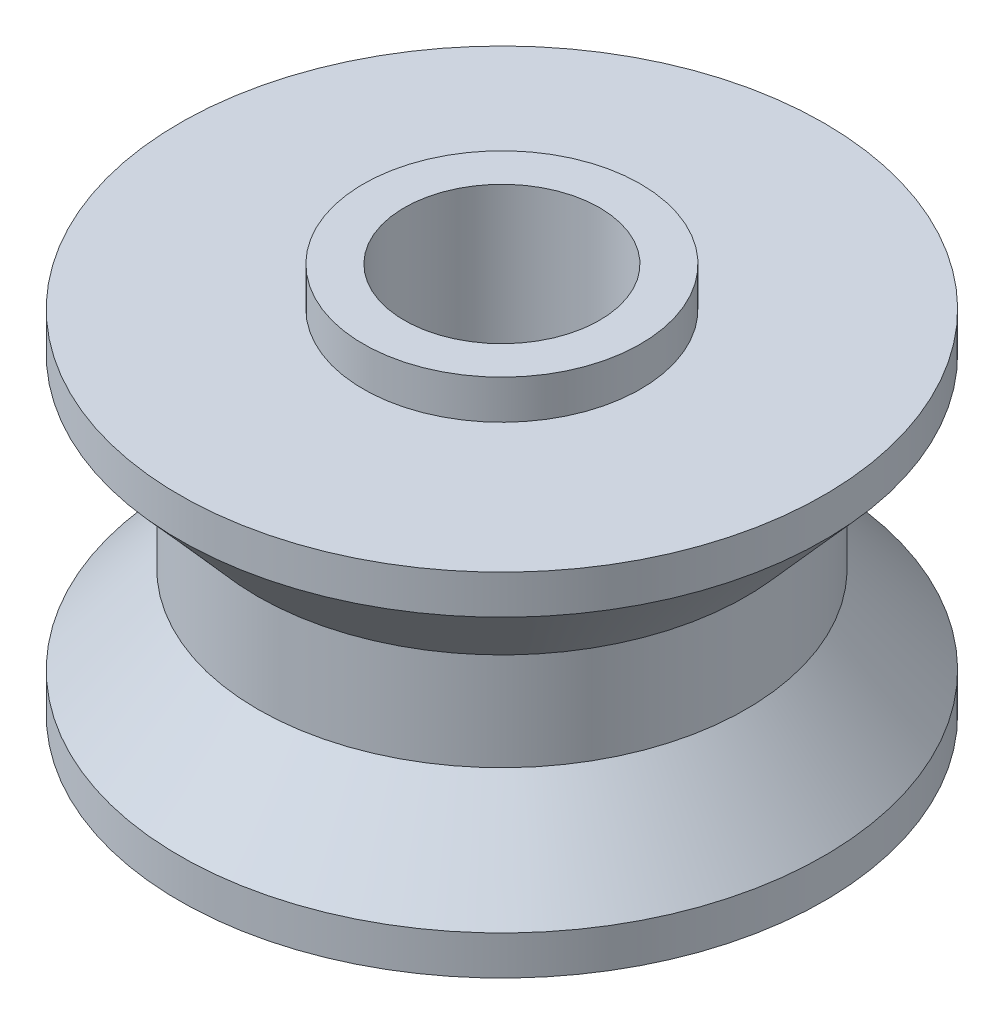
ISO-10303-21;
HEADER;
FILE_DESCRIPTION(('STEP AP214'),'2;1');
FILE_NAME('part.step','',(''),(''),'','','');
FILE_SCHEMA(('AUTOMOTIVE_DESIGN { 1 0 10303 214 1 1 1 1 }'));
ENDSEC;
DATA;
#1=APPLICATION_CONTEXT('core data for automotive mechanical design processes');
#2=APPLICATION_PROTOCOL_DEFINITION('international standard','automotive_design',2000,#1);
#3=PRODUCT_CONTEXT('',#1,'mechanical');
#4=PRODUCT('Part','Part','',(#3));
#5=PRODUCT_RELATED_PRODUCT_CATEGORY('part','',(#4));
#6=PRODUCT_DEFINITION_FORMATION('','',#4);
#7=PRODUCT_DEFINITION_CONTEXT('part definition',#1,'design');
#8=PRODUCT_DEFINITION('design','',#6,#7);
#9=PRODUCT_DEFINITION_SHAPE('','',#8);
#10=(LENGTH_UNIT() NAMED_UNIT(*) SI_UNIT(.MILLI.,.METRE.));
#11=(NAMED_UNIT(*) PLANE_ANGLE_UNIT() SI_UNIT($,.RADIAN.));
#12=(NAMED_UNIT(*) SI_UNIT($,.STERADIAN.) SOLID_ANGLE_UNIT());
#13=UNCERTAINTY_MEASURE_WITH_UNIT(LENGTH_MEASURE(1.E-05),#10,'distance_accuracy_value','');
#14=(GEOMETRIC_REPRESENTATION_CONTEXT(3) GLOBAL_UNCERTAINTY_ASSIGNED_CONTEXT((#13)) GLOBAL_UNIT_ASSIGNED_CONTEXT((#10,
#11,#12)) REPRESENTATION_CONTEXT('',''));
#15=CARTESIAN_POINT('',(0.,0.,0.));
#16=DIRECTION('',(0.,0.,1.));
#17=DIRECTION('',(1.,0.,0.));
#18=AXIS2_PLACEMENT_3D('',#15,#16,#17);
#19=CARTESIAN_POINT('',(0.,0.,0.));
#20=DIRECTION('',(0.,-1.,0.));
#21=DIRECTION('',(0.,0.,-1.));
#22=AXIS2_PLACEMENT_3D('',#19,#20,#21);
#23=CYLINDRICAL_SURFACE('',#22,2.5);
#24=CARTESIAN_POINT('',(0.,-5.5,0.));
#25=DIRECTION('',(0.,-1.,0.));
#26=DIRECTION('',(0.,0.,-1.));
#27=AXIS2_PLACEMENT_3D('',#24,#25,#26);
#28=CIRCLE('',#27,2.5);
#29=CARTESIAN_POINT('',(0.,-5.5,-2.5));
#30=VERTEX_POINT('',#29);
#31=EDGE_CURVE('E10',#30,#30,#28,.T.);
#32=ORIENTED_EDGE('',*,*,#31,.T.);
#33=EDGE_LOOP('',(#32));
#34=FACE_BOUND('',#33,.T.);
#35=CARTESIAN_POINT('',(0.,5.5,0.));
#36=DIRECTION('',(0.,-1.,0.));
#37=DIRECTION('',(0.,0.,-1.));
#38=AXIS2_PLACEMENT_3D('',#35,#36,#37);
#39=CIRCLE('',#38,2.5);
#40=CARTESIAN_POINT('',(0.,5.5,-2.5));
#41=VERTEX_POINT('',#40);
#42=EDGE_CURVE('E92',#41,#41,#39,.T.);
#43=ORIENTED_EDGE('',*,*,#42,.F.);
#44=EDGE_LOOP('',(#43));
#45=FACE_BOUND('',#44,.T.);
#46=ADVANCED_FACE('F41',(#34,#45),#23,.F.);
#47=CARTESIAN_POINT('',(2.5,-5.5,0.));
#48=DIRECTION('',(0.,-1.,0.));
#49=DIRECTION('',(0.,0.,-1.));
#50=AXIS2_PLACEMENT_3D('',#47,#48,#49);
#51=PLANE('',#50);
#52=CARTESIAN_POINT('',(0.,-5.5,0.));
#53=DIRECTION('',(0.,-1.,0.));
#54=DIRECTION('',(0.,0.,-1.));
#55=AXIS2_PLACEMENT_3D('',#52,#53,#54);
#56=CIRCLE('',#55,3.55);
#57=CARTESIAN_POINT('',(0.,-5.5,-3.55));
#58=VERTEX_POINT('',#57);
#59=EDGE_CURVE('E48',#58,#58,#56,.T.);
#60=ORIENTED_EDGE('',*,*,#59,.T.);
#61=EDGE_LOOP('',(#60));
#62=FACE_BOUND('',#61,.T.);
#63=ORIENTED_EDGE('',*,*,#31,.F.);
#64=EDGE_LOOP('',(#63));
#65=FACE_BOUND('',#64,.T.);
#66=ADVANCED_FACE('F101',(#62,#65),#51,.T.);
#67=CARTESIAN_POINT('',(0.,0.,0.));
#68=DIRECTION('',(0.,-1.,0.));
#69=DIRECTION('',(0.,0.,-1.));
#70=AXIS2_PLACEMENT_3D('',#67,#68,#69);
#71=CYLINDRICAL_SURFACE('',#70,3.55);
#72=CARTESIAN_POINT('',(0.,-4.5,0.));
#73=DIRECTION('',(0.,-1.,0.));
#74=DIRECTION('',(0.,0.,-1.));
#75=AXIS2_PLACEMENT_3D('',#72,#73,#74);
#76=CIRCLE('',#75,3.55);
#77=CARTESIAN_POINT('',(0.,-4.5,-3.55));
#78=VERTEX_POINT('',#77);
#79=EDGE_CURVE('E53',#78,#78,#76,.T.);
#80=ORIENTED_EDGE('',*,*,#79,.T.);
#81=EDGE_LOOP('',(#80));
#82=FACE_BOUND('',#81,.T.);
#83=ORIENTED_EDGE('',*,*,#59,.F.);
#84=EDGE_LOOP('',(#83));
#85=FACE_BOUND('',#84,.T.);
#86=ADVANCED_FACE('F105',(#82,#85),#71,.T.);
#87=CARTESIAN_POINT('',(3.55,-4.5,0.));
#88=DIRECTION('',(0.,-1.,0.));
#89=DIRECTION('',(0.,0.,-1.));
#90=AXIS2_PLACEMENT_3D('',#87,#88,#89);
#91=PLANE('',#90);
#92=CARTESIAN_POINT('',(0.,-4.5,0.));
#93=DIRECTION('',(0.,-1.,0.));
#94=DIRECTION('',(0.,0.,-1.));
#95=AXIS2_PLACEMENT_3D('',#92,#93,#94);
#96=CIRCLE('',#95,8.25);
#97=CARTESIAN_POINT('',(0.,-4.5,-8.25));
#98=VERTEX_POINT('',#97);
#99=EDGE_CURVE('E58',#98,#98,#96,.T.);
#100=ORIENTED_EDGE('',*,*,#99,.T.);
#101=EDGE_LOOP('',(#100));
#102=FACE_BOUND('',#101,.T.);
#103=ORIENTED_EDGE('',*,*,#79,.F.);
#104=EDGE_LOOP('',(#103));
#105=FACE_BOUND('',#104,.T.);
#106=ADVANCED_FACE('F109',(#102,#105),#91,.T.);
#107=CARTESIAN_POINT('',(0.,0.,0.));
#108=DIRECTION('',(0.,-1.,0.));
#109=DIRECTION('',(0.,0.,-1.));
#110=AXIS2_PLACEMENT_3D('',#107,#108,#109);
#111=CYLINDRICAL_SURFACE('',#110,8.25);
#112=CARTESIAN_POINT('',(0.,-3.5,0.));
#113=DIRECTION('',(0.,-1.,0.));
#114=DIRECTION('',(0.,0.,-1.));
#115=AXIS2_PLACEMENT_3D('',#112,#113,#114);
#116=CIRCLE('',#115,8.25);
#117=CARTESIAN_POINT('',(0.,-3.5,-8.25));
#118=VERTEX_POINT('',#117);
#119=EDGE_CURVE('E64',#118,#118,#116,.T.);
#120=ORIENTED_EDGE('',*,*,#119,.T.);
#121=EDGE_LOOP('',(#120));
#122=FACE_BOUND('',#121,.T.);
#123=ORIENTED_EDGE('',*,*,#99,.F.);
#124=EDGE_LOOP('',(#123));
#125=FACE_BOUND('',#124,.T.);
#126=ADVANCED_FACE('F116',(#122,#125),#111,.T.);
#127=CARTESIAN_POINT('',(0.,-3.5,0.));
#128=DIRECTION('',(0.,-1.,0.));
#129=DIRECTION('',(0.,0.,-1.));
#130=AXIS2_PLACEMENT_3D('',#127,#128,#129);
#131=CONICAL_SURFACE('',#130,8.25,0.726642340681726);
#132=CARTESIAN_POINT('',(0.,-1.25,0.));
#133=DIRECTION('',(0.,-1.,0.));
#134=DIRECTION('',(0.,0.,-1.));
#135=AXIS2_PLACEMENT_3D('',#132,#133,#134);
#136=CIRCLE('',#135,6.25);
#137=CARTESIAN_POINT('',(0.,-1.25,-6.25));
#138=VERTEX_POINT('',#137);
#139=EDGE_CURVE('E68',#138,#138,#136,.T.);
#140=ORIENTED_EDGE('',*,*,#139,.T.);
#141=EDGE_LOOP('',(#140));
#142=FACE_BOUND('',#141,.T.);
#143=ORIENTED_EDGE('',*,*,#119,.F.);
#144=EDGE_LOOP('',(#143));
#145=FACE_BOUND('',#144,.T.);
#146=ADVANCED_FACE('F120',(#142,#145),#131,.T.);
#147=CARTESIAN_POINT('',(0.,0.,0.));
#148=DIRECTION('',(0.,-1.,0.));
#149=DIRECTION('',(0.,0.,-1.));
#150=AXIS2_PLACEMENT_3D('',#147,#148,#149);
#151=CYLINDRICAL_SURFACE('',#150,6.25);
#152=CARTESIAN_POINT('',(0.,1.25,0.));
#153=DIRECTION('',(0.,-1.,0.));
#154=DIRECTION('',(0.,0.,-1.));
#155=AXIS2_PLACEMENT_3D('',#152,#153,#154);
#156=CIRCLE('',#155,6.25);
#157=CARTESIAN_POINT('',(0.,1.25,-6.25));
#158=VERTEX_POINT('',#157);
#159=EDGE_CURVE('E72',#158,#158,#156,.T.);
#160=ORIENTED_EDGE('',*,*,#159,.T.);
#161=EDGE_LOOP('',(#160));
#162=FACE_BOUND('',#161,.T.);
#163=ORIENTED_EDGE('',*,*,#139,.F.);
#164=EDGE_LOOP('',(#163));
#165=FACE_BOUND('',#164,.T.);
#166=ADVANCED_FACE('F124',(#162,#165),#151,.T.);
#167=CARTESIAN_POINT('',(0.,1.25,0.));
#168=DIRECTION('',(0.,1.,0.));
#169=DIRECTION('',(0.,0.,1.));
#170=AXIS2_PLACEMENT_3D('',#167,#168,#169);
#171=CONICAL_SURFACE('',#170,6.25,0.726642340681726);
#172=CARTESIAN_POINT('',(0.,3.5,0.));
#173=DIRECTION('',(0.,-1.,0.));
#174=DIRECTION('',(0.,0.,-1.));
#175=AXIS2_PLACEMENT_3D('',#172,#173,#174);
#176=CIRCLE('',#175,8.25);
#177=CARTESIAN_POINT('',(0.,3.5,-8.25));
#178=VERTEX_POINT('',#177);
#179=EDGE_CURVE('E76',#178,#178,#176,.T.);
#180=ORIENTED_EDGE('',*,*,#179,.T.);
#181=EDGE_LOOP('',(#180));
#182=FACE_BOUND('',#181,.T.);
#183=ORIENTED_EDGE('',*,*,#159,.F.);
#184=EDGE_LOOP('',(#183));
#185=FACE_BOUND('',#184,.T.);
#186=ADVANCED_FACE('F128',(#182,#185),#171,.T.);
#187=CARTESIAN_POINT('',(0.,0.,0.));
#188=DIRECTION('',(0.,-1.,0.));
#189=DIRECTION('',(0.,0.,-1.));
#190=AXIS2_PLACEMENT_3D('',#187,#188,#189);
#191=CYLINDRICAL_SURFACE('',#190,8.25);
#192=CARTESIAN_POINT('',(0.,4.5,0.));
#193=DIRECTION('',(0.,-1.,0.));
#194=DIRECTION('',(0.,0.,-1.));
#195=AXIS2_PLACEMENT_3D('',#192,#193,#194);
#196=CIRCLE('',#195,8.25);
#197=CARTESIAN_POINT('',(0.,4.5,-8.25));
#198=VERTEX_POINT('',#197);
#199=EDGE_CURVE('E80',#198,#198,#196,.T.);
#200=ORIENTED_EDGE('',*,*,#199,.T.);
#201=EDGE_LOOP('',(#200));
#202=FACE_BOUND('',#201,.T.);
#203=ORIENTED_EDGE('',*,*,#179,.F.);
#204=EDGE_LOOP('',(#203));
#205=FACE_BOUND('',#204,.T.);
#206=ADVANCED_FACE('F132',(#202,#205),#191,.T.);
#207=CARTESIAN_POINT('',(3.55,4.5,0.));
#208=DIRECTION('',(0.,1.,0.));
#209=DIRECTION('',(0.,0.,1.));
#210=AXIS2_PLACEMENT_3D('',#207,#208,#209);
#211=PLANE('',#210);
#212=CARTESIAN_POINT('',(0.,4.5,0.));
#213=DIRECTION('',(0.,-1.,0.));
#214=DIRECTION('',(0.,0.,-1.));
#215=AXIS2_PLACEMENT_3D('',#212,#213,#214);
#216=CIRCLE('',#215,3.55);
#217=CARTESIAN_POINT('',(0.,4.5,-3.55));
#218=VERTEX_POINT('',#217);
#219=EDGE_CURVE('E84',#218,#218,#216,.T.);
#220=ORIENTED_EDGE('',*,*,#219,.T.);
#221=EDGE_LOOP('',(#220));
#222=FACE_BOUND('',#221,.T.);
#223=ORIENTED_EDGE('',*,*,#199,.F.);
#224=EDGE_LOOP('',(#223));
#225=FACE_BOUND('',#224,.T.);
#226=ADVANCED_FACE('F136',(#222,#225),#211,.T.);
#227=CARTESIAN_POINT('',(0.,0.,0.));
#228=DIRECTION('',(0.,-1.,0.));
#229=DIRECTION('',(0.,0.,-1.));
#230=AXIS2_PLACEMENT_3D('',#227,#228,#229);
#231=CYLINDRICAL_SURFACE('',#230,3.55);
#232=CARTESIAN_POINT('',(0.,5.5,0.));
#233=DIRECTION('',(0.,-1.,0.));
#234=DIRECTION('',(0.,0.,-1.));
#235=AXIS2_PLACEMENT_3D('',#232,#233,#234);
#236=CIRCLE('',#235,3.55);
#237=CARTESIAN_POINT('',(0.,5.5,-3.55));
#238=VERTEX_POINT('',#237);
#239=EDGE_CURVE('E88',#238,#238,#236,.T.);
#240=ORIENTED_EDGE('',*,*,#239,.T.);
#241=EDGE_LOOP('',(#240));
#242=FACE_BOUND('',#241,.T.);
#243=ORIENTED_EDGE('',*,*,#219,.F.);
#244=EDGE_LOOP('',(#243));
#245=FACE_BOUND('',#244,.T.);
#246=ADVANCED_FACE('F140',(#242,#245),#231,.T.);
#247=CARTESIAN_POINT('',(2.5,5.5,0.));
#248=DIRECTION('',(0.,1.,0.));
#249=DIRECTION('',(0.,0.,1.));
#250=AXIS2_PLACEMENT_3D('',#247,#248,#249);
#251=PLANE('',#250);
#252=ORIENTED_EDGE('',*,*,#42,.T.);
#253=EDGE_LOOP('',(#252));
#254=FACE_BOUND('',#253,.T.);
#255=ORIENTED_EDGE('',*,*,#239,.F.);
#256=EDGE_LOOP('',(#255));
#257=FACE_BOUND('',#256,.T.);
#258=ADVANCED_FACE('F97',(#254,#257),#251,.T.);
#259=CLOSED_SHELL('',(#46,#66,#86,#106,#126,#146,#166,#186,#206,#226,#246,#258));
#260=MANIFOLD_SOLID_BREP('B2',#259);
#261=ADVANCED_BREP_SHAPE_REPRESENTATION('',(#18,#260),#14);
#262=SHAPE_DEFINITION_REPRESENTATION(#9,#261);
ENDSEC;
END-ISO-10303-21;
